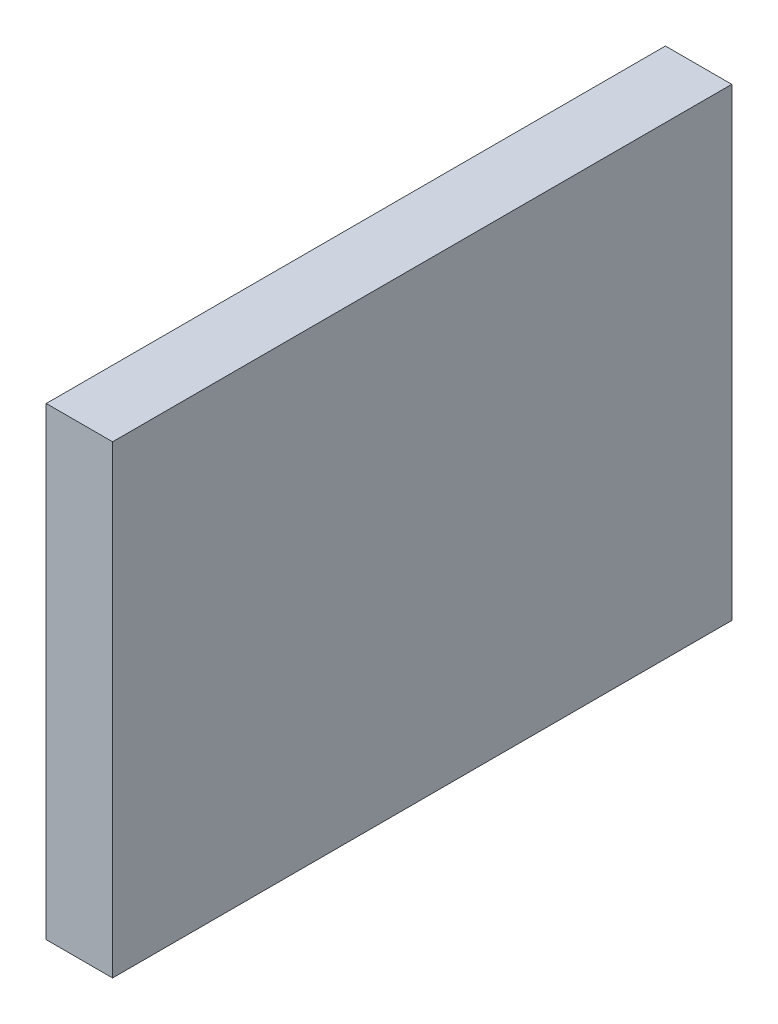
ISO-10303-21;
HEADER;
FILE_DESCRIPTION(('STEP AP214'),'2;1');
FILE_NAME('part.step','',(''),(''),'','','');
FILE_SCHEMA(('AUTOMOTIVE_DESIGN { 1 0 10303 214 1 1 1 1 }'));
ENDSEC;
DATA;
#1=APPLICATION_CONTEXT('core data for automotive mechanical design processes');
#2=APPLICATION_PROTOCOL_DEFINITION('international standard','automotive_design',2000,#1);
#3=PRODUCT_CONTEXT('',#1,'mechanical');
#4=PRODUCT('Part','Part','',(#3));
#5=PRODUCT_RELATED_PRODUCT_CATEGORY('part','',(#4));
#6=PRODUCT_DEFINITION_FORMATION('','',#4);
#7=PRODUCT_DEFINITION_CONTEXT('part definition',#1,'design');
#8=PRODUCT_DEFINITION('design','',#6,#7);
#9=PRODUCT_DEFINITION_SHAPE('','',#8);
#10=(LENGTH_UNIT() NAMED_UNIT(*) SI_UNIT(.MILLI.,.METRE.));
#11=(NAMED_UNIT(*) PLANE_ANGLE_UNIT() SI_UNIT($,.RADIAN.));
#12=(NAMED_UNIT(*) SI_UNIT($,.STERADIAN.) SOLID_ANGLE_UNIT());
#13=UNCERTAINTY_MEASURE_WITH_UNIT(LENGTH_MEASURE(1.E-05),#10,'distance_accuracy_value','');
#14=(GEOMETRIC_REPRESENTATION_CONTEXT(3) GLOBAL_UNCERTAINTY_ASSIGNED_CONTEXT((#13)) GLOBAL_UNIT_ASSIGNED_CONTEXT((#10,
#11,#12)) REPRESENTATION_CONTEXT('',''));
#15=CARTESIAN_POINT('',(0.,0.,0.));
#16=DIRECTION('',(0.,0.,1.));
#17=DIRECTION('',(1.,0.,0.));
#18=AXIS2_PLACEMENT_3D('',#15,#16,#17);
#19=CARTESIAN_POINT('',(15.,0.,0.));
#20=DIRECTION('',(0.,0.,-1.));
#21=DIRECTION('',(0.,1.,0.));
#22=AXIS2_PLACEMENT_3D('',#19,#20,#21);
#23=PLANE('',#22);
#24=DIRECTION('',(0.,-1.,0.));
#25=VECTOR('',#24,1.);
#26=CARTESIAN_POINT('',(0.,0.,0.));
#27=LINE('',#26,#25);
#28=CARTESIAN_POINT('',(0.,0.,0.));
#29=VERTEX_POINT('',#28);
#30=CARTESIAN_POINT('',(0.,-105.,0.));
#31=VERTEX_POINT('',#30);
#32=EDGE_CURVE('E110',#29,#31,#27,.T.);
#33=ORIENTED_EDGE('',*,*,#32,.T.);
#34=DIRECTION('',(-1.,0.,0.));
#35=VECTOR('',#34,1.);
#36=CARTESIAN_POINT('',(15.,-105.,0.));
#37=LINE('',#36,#35);
#38=CARTESIAN_POINT('',(15.,-105.,0.));
#39=VERTEX_POINT('',#38);
#40=EDGE_CURVE('E11',#39,#31,#37,.T.);
#41=ORIENTED_EDGE('',*,*,#40,.F.);
#42=DIRECTION('',(0.,-1.,0.));
#43=VECTOR('',#42,1.);
#44=CARTESIAN_POINT('',(15.,0.,0.));
#45=LINE('',#44,#43);
#46=CARTESIAN_POINT('',(15.,0.,0.));
#47=VERTEX_POINT('',#46);
#48=EDGE_CURVE('E94',#47,#39,#45,.T.);
#49=ORIENTED_EDGE('',*,*,#48,.F.);
#50=DIRECTION('',(-1.,0.,0.));
#51=VECTOR('',#50,1.);
#52=CARTESIAN_POINT('',(15.,0.,0.));
#53=LINE('',#52,#51);
#54=EDGE_CURVE('E106',#47,#29,#53,.T.);
#55=ORIENTED_EDGE('',*,*,#54,.T.);
#56=EDGE_LOOP('',(#33,#41,#49,#55));
#57=FACE_BOUND('',#56,.T.);
#58=ADVANCED_FACE('F42',(#57),#23,.F.);
#59=CARTESIAN_POINT('',(15.,-105.,0.));
#60=DIRECTION('',(0.,1.,0.));
#61=DIRECTION('',(0.,0.,1.));
#62=AXIS2_PLACEMENT_3D('',#59,#60,#61);
#63=PLANE('',#62);
#64=DIRECTION('',(0.,0.,-1.));
#65=VECTOR('',#64,1.);
#66=CARTESIAN_POINT('',(0.,-105.,0.));
#67=LINE('',#66,#65);
#68=CARTESIAN_POINT('',(0.,-105.,-140.));
#69=VERTEX_POINT('',#68);
#70=EDGE_CURVE('E99',#31,#69,#67,.T.);
#71=ORIENTED_EDGE('',*,*,#70,.T.);
#72=DIRECTION('',(-1.,0.,0.));
#73=VECTOR('',#72,1.);
#74=CARTESIAN_POINT('',(15.,-105.,-140.));
#75=LINE('',#74,#73);
#76=CARTESIAN_POINT('',(15.,-105.,-140.));
#77=VERTEX_POINT('',#76);
#78=EDGE_CURVE('E51',#77,#69,#75,.T.);
#79=ORIENTED_EDGE('',*,*,#78,.F.);
#80=DIRECTION('',(0.,0.,-1.));
#81=VECTOR('',#80,1.);
#82=CARTESIAN_POINT('',(15.,-105.,0.));
#83=LINE('',#82,#81);
#84=EDGE_CURVE('E89',#39,#77,#83,.T.);
#85=ORIENTED_EDGE('',*,*,#84,.F.);
#86=ORIENTED_EDGE('',*,*,#40,.T.);
#87=EDGE_LOOP('',(#71,#79,#85,#86));
#88=FACE_BOUND('',#87,.T.);
#89=ADVANCED_FACE('F98',(#88),#63,.F.);
#90=CARTESIAN_POINT('',(15.,0.,-140.));
#91=DIRECTION('',(0.,0.,1.));
#92=DIRECTION('',(1.,0.,0.));
#93=AXIS2_PLACEMENT_3D('',#90,#91,#92);
#94=PLANE('',#93);
#95=DIRECTION('',(0.,1.,0.));
#96=VECTOR('',#95,1.);
#97=CARTESIAN_POINT('',(0.,0.,-140.));
#98=LINE('',#97,#96);
#99=CARTESIAN_POINT('',(0.,0.,-140.));
#100=VERTEX_POINT('',#99);
#101=EDGE_CURVE('E76',#69,#100,#98,.T.);
#102=ORIENTED_EDGE('',*,*,#101,.T.);
#103=DIRECTION('',(-1.,0.,0.));
#104=VECTOR('',#103,1.);
#105=CARTESIAN_POINT('',(15.,0.,-140.));
#106=LINE('',#105,#104);
#107=CARTESIAN_POINT('',(15.,0.,-140.));
#108=VERTEX_POINT('',#107);
#109=EDGE_CURVE('E101',#108,#100,#106,.T.);
#110=ORIENTED_EDGE('',*,*,#109,.F.);
#111=DIRECTION('',(0.,1.,0.));
#112=VECTOR('',#111,1.);
#113=CARTESIAN_POINT('',(15.,0.,-140.));
#114=LINE('',#113,#112);
#115=EDGE_CURVE('E92',#77,#108,#114,.T.);
#116=ORIENTED_EDGE('',*,*,#115,.F.);
#117=ORIENTED_EDGE('',*,*,#78,.T.);
#118=EDGE_LOOP('',(#102,#110,#116,#117));
#119=FACE_BOUND('',#118,.T.);
#120=ADVANCED_FACE('F102',(#119),#94,.F.);
#121=CARTESIAN_POINT('',(15.,0.,0.));
#122=DIRECTION('',(0.,-1.,0.));
#123=DIRECTION('',(0.,0.,-1.));
#124=AXIS2_PLACEMENT_3D('',#121,#122,#123);
#125=PLANE('',#124);
#126=DIRECTION('',(0.,0.,1.));
#127=VECTOR('',#126,1.);
#128=CARTESIAN_POINT('',(0.,0.,0.));
#129=LINE('',#128,#127);
#130=EDGE_CURVE('E82',#100,#29,#129,.T.);
#131=ORIENTED_EDGE('',*,*,#130,.T.);
#132=ORIENTED_EDGE('',*,*,#54,.F.);
#133=DIRECTION('',(0.,0.,1.));
#134=VECTOR('',#133,1.);
#135=CARTESIAN_POINT('',(15.,0.,0.));
#136=LINE('',#135,#134);
#137=EDGE_CURVE('E59',#108,#47,#136,.T.);
#138=ORIENTED_EDGE('',*,*,#137,.F.);
#139=ORIENTED_EDGE('',*,*,#109,.T.);
#140=EDGE_LOOP('',(#131,#132,#138,#139));
#141=FACE_BOUND('',#140,.T.);
#142=ADVANCED_FACE('F123',(#141),#125,.F.);
#143=CARTESIAN_POINT('',(15.,0.,0.));
#144=DIRECTION('',(1.,0.,0.));
#145=DIRECTION('',(0.,0.,-1.));
#146=AXIS2_PLACEMENT_3D('',#143,#144,#145);
#147=PLANE('',#146);
#148=ORIENTED_EDGE('',*,*,#48,.T.);
#149=ORIENTED_EDGE('',*,*,#84,.T.);
#150=ORIENTED_EDGE('',*,*,#115,.T.);
#151=ORIENTED_EDGE('',*,*,#137,.T.);
#152=EDGE_LOOP('',(#148,#149,#150,#151));
#153=FACE_BOUND('',#152,.T.);
#154=ADVANCED_FACE('F90',(#153),#147,.T.);
#155=CARTESIAN_POINT('',(0.,0.,0.));
#156=DIRECTION('',(1.,0.,0.));
#157=DIRECTION('',(0.,0.,-1.));
#158=AXIS2_PLACEMENT_3D('',#155,#156,#157);
#159=PLANE('',#158);
#160=ORIENTED_EDGE('',*,*,#32,.F.);
#161=ORIENTED_EDGE('',*,*,#130,.F.);
#162=ORIENTED_EDGE('',*,*,#101,.F.);
#163=ORIENTED_EDGE('',*,*,#70,.F.);
#164=EDGE_LOOP('',(#160,#161,#162,#163));
#165=FACE_BOUND('',#164,.T.);
#166=ADVANCED_FACE('F126',(#165),#159,.F.);
#167=CLOSED_SHELL('',(#58,#89,#120,#142,#154,#166));
#168=MANIFOLD_SOLID_BREP('B2',#167);
#169=ADVANCED_BREP_SHAPE_REPRESENTATION('',(#18,#168),#14);
#170=SHAPE_DEFINITION_REPRESENTATION(#9,#169);
ENDSEC;
END-ISO-10303-21;
